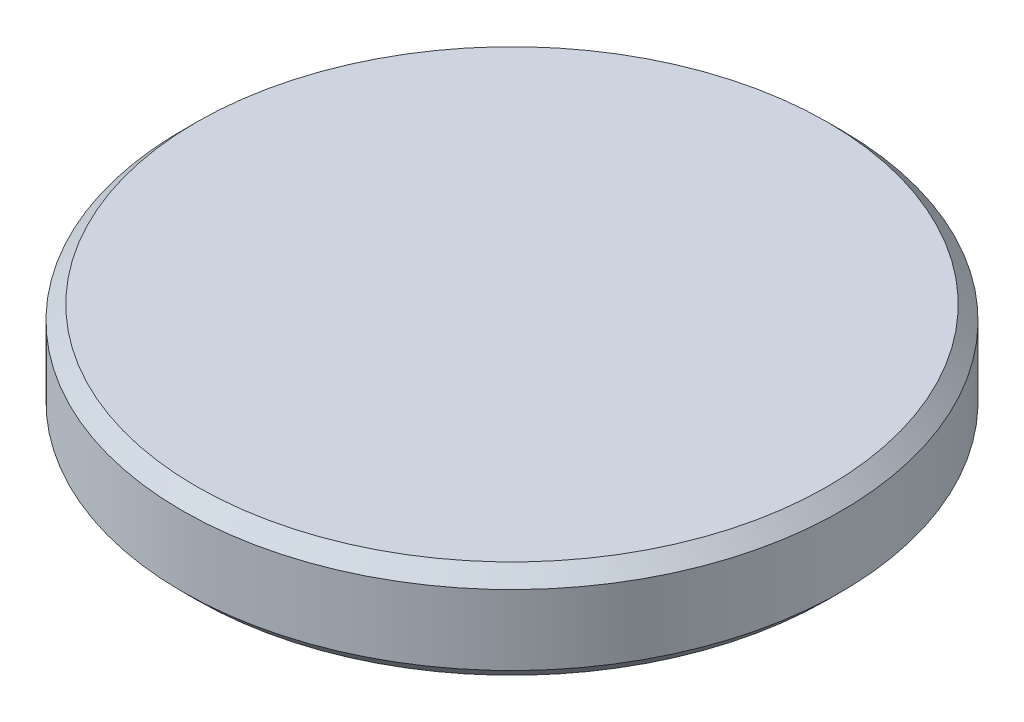
ISO-10303-21;
HEADER;
FILE_DESCRIPTION(('STEP AP214'),'2;1');
FILE_NAME('part.step','',(''),(''),'','','');
FILE_SCHEMA(('AUTOMOTIVE_DESIGN { 1 0 10303 214 1 1 1 1 }'));
ENDSEC;
DATA;
#1=APPLICATION_CONTEXT('core data for automotive mechanical design processes');
#2=APPLICATION_PROTOCOL_DEFINITION('international standard','automotive_design',2000,#1);
#3=PRODUCT_CONTEXT('',#1,'mechanical');
#4=PRODUCT('Part','Part','',(#3));
#5=PRODUCT_RELATED_PRODUCT_CATEGORY('part','',(#4));
#6=PRODUCT_DEFINITION_FORMATION('','',#4);
#7=PRODUCT_DEFINITION_CONTEXT('part definition',#1,'design');
#8=PRODUCT_DEFINITION('design','',#6,#7);
#9=PRODUCT_DEFINITION_SHAPE('','',#8);
#10=(LENGTH_UNIT() NAMED_UNIT(*) SI_UNIT(.MILLI.,.METRE.));
#11=(NAMED_UNIT(*) PLANE_ANGLE_UNIT() SI_UNIT($,.RADIAN.));
#12=(NAMED_UNIT(*) SI_UNIT($,.STERADIAN.) SOLID_ANGLE_UNIT());
#13=UNCERTAINTY_MEASURE_WITH_UNIT(LENGTH_MEASURE(1.E-05),#10,'distance_accuracy_value','');
#14=(GEOMETRIC_REPRESENTATION_CONTEXT(3) GLOBAL_UNCERTAINTY_ASSIGNED_CONTEXT((#13)) GLOBAL_UNIT_ASSIGNED_CONTEXT((#10,
#11,#12)) REPRESENTATION_CONTEXT('',''));
#15=CARTESIAN_POINT('',(0.,0.,0.));
#16=DIRECTION('',(0.,0.,1.));
#17=DIRECTION('',(1.,0.,0.));
#18=AXIS2_PLACEMENT_3D('',#15,#16,#17);
#19=CARTESIAN_POINT('',(0.,1.05,0.));
#20=DIRECTION('',(0.,-1.,0.));
#21=DIRECTION('',(0.,0.,-1.));
#22=AXIS2_PLACEMENT_3D('',#19,#20,#21);
#23=CYLINDRICAL_SURFACE('',#22,3.525);
#24=CARTESIAN_POINT('',(0.,0.15,0.));
#25=DIRECTION('',(0.,1.,0.));
#26=DIRECTION('',(0.,0.,1.));
#27=AXIS2_PLACEMENT_3D('',#24,#25,#26);
#28=CIRCLE('',#27,3.525);
#29=CARTESIAN_POINT('',(0.,0.15,3.525));
#30=VERTEX_POINT('',#29);
#31=EDGE_CURVE('E41',#30,#30,#28,.T.);
#32=ORIENTED_EDGE('',*,*,#31,.T.);
#33=EDGE_LOOP('',(#32));
#34=FACE_BOUND('',#33,.T.);
#35=CARTESIAN_POINT('',(0.,0.900000000000001,0.));
#36=DIRECTION('',(0.,1.,0.));
#37=DIRECTION('',(0.,0.,1.));
#38=AXIS2_PLACEMENT_3D('',#35,#36,#37);
#39=CIRCLE('',#38,3.525);
#40=CARTESIAN_POINT('',(0.,0.900000000000001,3.525));
#41=VERTEX_POINT('',#40);
#42=EDGE_CURVE('E45',#41,#41,#39,.F.);
#43=ORIENTED_EDGE('',*,*,#42,.T.);
#44=EDGE_LOOP('',(#43));
#45=FACE_BOUND('',#44,.T.);
#46=ADVANCED_FACE('F30',(#34,#45),#23,.T.);
#47=CARTESIAN_POINT('',(0.,1.05,0.));
#48=DIRECTION('',(0.,1.,0.));
#49=DIRECTION('',(0.,0.,1.));
#50=AXIS2_PLACEMENT_3D('',#47,#48,#49);
#51=PLANE('',#50);
#52=CARTESIAN_POINT('',(0.,1.05,0.));
#53=DIRECTION('',(0.,1.,0.));
#54=DIRECTION('',(0.,0.,1.));
#55=AXIS2_PLACEMENT_3D('',#52,#53,#54);
#56=CIRCLE('',#55,3.375);
#57=CARTESIAN_POINT('',(0.,1.05,3.375));
#58=VERTEX_POINT('',#57);
#59=EDGE_CURVE('E10',#58,#58,#56,.T.);
#60=ORIENTED_EDGE('',*,*,#59,.T.);
#61=EDGE_LOOP('',(#60));
#62=FACE_BOUND('',#61,.T.);
#63=ADVANCED_FACE('F61',(#62),#51,.T.);
#64=CARTESIAN_POINT('',(0.,0.,0.));
#65=DIRECTION('',(0.,1.,0.));
#66=DIRECTION('',(0.,0.,1.));
#67=AXIS2_PLACEMENT_3D('',#64,#65,#66);
#68=PLANE('',#67);
#69=CARTESIAN_POINT('',(0.,0.,0.));
#70=DIRECTION('',(0.,1.,0.));
#71=DIRECTION('',(0.,0.,1.));
#72=AXIS2_PLACEMENT_3D('',#69,#70,#71);
#73=CIRCLE('',#72,3.375);
#74=CARTESIAN_POINT('',(0.,0.,3.375));
#75=VERTEX_POINT('',#74);
#76=EDGE_CURVE('E37',#75,#75,#73,.F.);
#77=ORIENTED_EDGE('',*,*,#76,.T.);
#78=EDGE_LOOP('',(#77));
#79=FACE_BOUND('',#78,.T.);
#80=ADVANCED_FACE('F58',(#79),#68,.F.);
#81=CARTESIAN_POINT('',(0.,0.15,0.));
#82=DIRECTION('',(0.,1.,0.));
#83=DIRECTION('',(0.,0.,1.));
#84=AXIS2_PLACEMENT_3D('',#81,#82,#83);
#85=CONICAL_SURFACE('',#84,3.525,0.785398163397448);
#86=ORIENTED_EDGE('',*,*,#76,.F.);
#87=EDGE_LOOP('',(#86));
#88=FACE_BOUND('',#87,.T.);
#89=ORIENTED_EDGE('',*,*,#31,.F.);
#90=EDGE_LOOP('',(#89));
#91=FACE_BOUND('',#90,.T.);
#92=ADVANCED_FACE('F54',(#88,#91),#85,.T.);
#93=CARTESIAN_POINT('',(0.,1.05,0.));
#94=DIRECTION('',(0.,-1.,0.));
#95=DIRECTION('',(0.,0.,-1.));
#96=AXIS2_PLACEMENT_3D('',#93,#94,#95);
#97=CONICAL_SURFACE('',#96,3.375,0.785398163397445);
#98=ORIENTED_EDGE('',*,*,#42,.F.);
#99=EDGE_LOOP('',(#98));
#100=FACE_BOUND('',#99,.T.);
#101=ORIENTED_EDGE('',*,*,#59,.F.);
#102=EDGE_LOOP('',(#101));
#103=FACE_BOUND('',#102,.T.);
#104=ADVANCED_FACE('F32',(#100,#103),#97,.T.);
#105=CLOSED_SHELL('',(#46,#63,#80,#92,#104));
#106=MANIFOLD_SOLID_BREP('B2',#105);
#107=ADVANCED_BREP_SHAPE_REPRESENTATION('',(#18,#106),#14);
#108=SHAPE_DEFINITION_REPRESENTATION(#9,#107);
ENDSEC;
END-ISO-10303-21;
